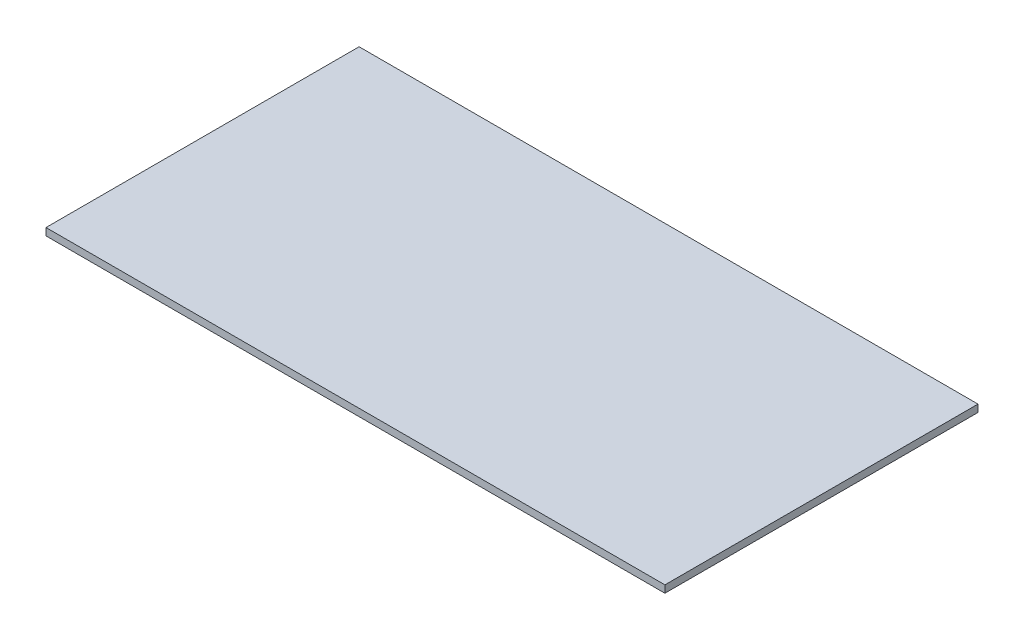
ISO-10303-21;
HEADER;
FILE_DESCRIPTION(('STEP AP214'),'2;1');
FILE_NAME('part.step','',(''),(''),'','','');
FILE_SCHEMA(('AUTOMOTIVE_DESIGN { 1 0 10303 214 1 1 1 1 }'));
ENDSEC;
DATA;
#1=APPLICATION_CONTEXT('core data for automotive mechanical design processes');
#2=APPLICATION_PROTOCOL_DEFINITION('international standard','automotive_design',2000,#1);
#3=PRODUCT_CONTEXT('',#1,'mechanical');
#4=PRODUCT('Part','Part','',(#3));
#5=PRODUCT_RELATED_PRODUCT_CATEGORY('part','',(#4));
#6=PRODUCT_DEFINITION_FORMATION('','',#4);
#7=PRODUCT_DEFINITION_CONTEXT('part definition',#1,'design');
#8=PRODUCT_DEFINITION('design','',#6,#7);
#9=PRODUCT_DEFINITION_SHAPE('','',#8);
#10=(LENGTH_UNIT() NAMED_UNIT(*) SI_UNIT(.MILLI.,.METRE.));
#11=(NAMED_UNIT(*) PLANE_ANGLE_UNIT() SI_UNIT($,.RADIAN.));
#12=(NAMED_UNIT(*) SI_UNIT($,.STERADIAN.) SOLID_ANGLE_UNIT());
#13=UNCERTAINTY_MEASURE_WITH_UNIT(LENGTH_MEASURE(1.E-05),#10,'distance_accuracy_value','');
#14=(GEOMETRIC_REPRESENTATION_CONTEXT(3) GLOBAL_UNCERTAINTY_ASSIGNED_CONTEXT((#13)) GLOBAL_UNIT_ASSIGNED_CONTEXT((#10,
#11,#12)) REPRESENTATION_CONTEXT('',''));
#15=CARTESIAN_POINT('',(0.,0.,0.));
#16=DIRECTION('',(0.,0.,1.));
#17=DIRECTION('',(1.,0.,0.));
#18=AXIS2_PLACEMENT_3D('',#15,#16,#17);
#19=CARTESIAN_POINT('',(-425.,10.,215.));
#20=DIRECTION('',(1.,0.,0.));
#21=DIRECTION('',(0.,0.,-1.));
#22=AXIS2_PLACEMENT_3D('',#19,#20,#21);
#23=PLANE('',#22);
#24=DIRECTION('',(0.,0.,1.));
#25=VECTOR('',#24,1.);
#26=CARTESIAN_POINT('',(-425.,0.,215.));
#27=LINE('',#26,#25);
#28=CARTESIAN_POINT('',(-425.,0.,-215.));
#29=VERTEX_POINT('',#28);
#30=CARTESIAN_POINT('',(-425.,0.,215.));
#31=VERTEX_POINT('',#30);
#32=EDGE_CURVE('E97',#29,#31,#27,.T.);
#33=ORIENTED_EDGE('',*,*,#32,.T.);
#34=DIRECTION('',(0.,-1.,0.));
#35=VECTOR('',#34,1.);
#36=CARTESIAN_POINT('',(-425.,10.,215.));
#37=LINE('',#36,#35);
#38=CARTESIAN_POINT('',(-425.,10.,215.));
#39=VERTEX_POINT('',#38);
#40=EDGE_CURVE('E11',#39,#31,#37,.T.);
#41=ORIENTED_EDGE('',*,*,#40,.F.);
#42=DIRECTION('',(0.,0.,1.));
#43=VECTOR('',#42,1.);
#44=CARTESIAN_POINT('',(-425.,10.,215.));
#45=LINE('',#44,#43);
#46=CARTESIAN_POINT('',(-425.,10.,-215.));
#47=VERTEX_POINT('',#46);
#48=EDGE_CURVE('E85',#47,#39,#45,.T.);
#49=ORIENTED_EDGE('',*,*,#48,.F.);
#50=DIRECTION('',(0.,-1.,0.));
#51=VECTOR('',#50,1.);
#52=CARTESIAN_POINT('',(-425.,10.,-215.));
#53=LINE('',#52,#51);
#54=EDGE_CURVE('E93',#47,#29,#53,.T.);
#55=ORIENTED_EDGE('',*,*,#54,.T.);
#56=EDGE_LOOP('',(#33,#41,#49,#55));
#57=FACE_BOUND('',#56,.T.);
#58=ADVANCED_FACE('F34',(#57),#23,.F.);
#59=CARTESIAN_POINT('',(425.,10.,215.));
#60=DIRECTION('',(0.,0.,-1.));
#61=DIRECTION('',(-1.,0.,0.));
#62=AXIS2_PLACEMENT_3D('',#59,#60,#61);
#63=PLANE('',#62);
#64=DIRECTION('',(1.,0.,0.));
#65=VECTOR('',#64,1.);
#66=CARTESIAN_POINT('',(425.,0.,215.));
#67=LINE('',#66,#65);
#68=CARTESIAN_POINT('',(425.,0.,215.));
#69=VERTEX_POINT('',#68);
#70=EDGE_CURVE('E89',#31,#69,#67,.T.);
#71=ORIENTED_EDGE('',*,*,#70,.T.);
#72=DIRECTION('',(0.,-1.,0.));
#73=VECTOR('',#72,1.);
#74=CARTESIAN_POINT('',(425.,10.,215.));
#75=LINE('',#74,#73);
#76=CARTESIAN_POINT('',(425.,10.,215.));
#77=VERTEX_POINT('',#76);
#78=EDGE_CURVE('E42',#77,#69,#75,.T.);
#79=ORIENTED_EDGE('',*,*,#78,.F.);
#80=DIRECTION('',(1.,0.,0.));
#81=VECTOR('',#80,1.);
#82=CARTESIAN_POINT('',(425.,10.,215.));
#83=LINE('',#82,#81);
#84=EDGE_CURVE('E80',#39,#77,#83,.T.);
#85=ORIENTED_EDGE('',*,*,#84,.F.);
#86=ORIENTED_EDGE('',*,*,#40,.T.);
#87=EDGE_LOOP('',(#71,#79,#85,#86));
#88=FACE_BOUND('',#87,.T.);
#89=ADVANCED_FACE('F88',(#88),#63,.F.);
#90=CARTESIAN_POINT('',(425.,10.,215.));
#91=DIRECTION('',(-1.,0.,0.));
#92=DIRECTION('',(0.,0.,1.));
#93=AXIS2_PLACEMENT_3D('',#90,#91,#92);
#94=PLANE('',#93);
#95=DIRECTION('',(0.,0.,-1.));
#96=VECTOR('',#95,1.);
#97=CARTESIAN_POINT('',(425.,0.,215.));
#98=LINE('',#97,#96);
#99=CARTESIAN_POINT('',(425.,0.,-215.));
#100=VERTEX_POINT('',#99);
#101=EDGE_CURVE('E67',#69,#100,#98,.T.);
#102=ORIENTED_EDGE('',*,*,#101,.T.);
#103=DIRECTION('',(0.,-1.,0.));
#104=VECTOR('',#103,1.);
#105=CARTESIAN_POINT('',(425.,10.,-215.));
#106=LINE('',#105,#104);
#107=CARTESIAN_POINT('',(425.,10.,-215.));
#108=VERTEX_POINT('',#107);
#109=EDGE_CURVE('E90',#108,#100,#106,.T.);
#110=ORIENTED_EDGE('',*,*,#109,.F.);
#111=DIRECTION('',(0.,0.,-1.));
#112=VECTOR('',#111,1.);
#113=CARTESIAN_POINT('',(425.,10.,215.));
#114=LINE('',#113,#112);
#115=EDGE_CURVE('E83',#77,#108,#114,.T.);
#116=ORIENTED_EDGE('',*,*,#115,.F.);
#117=ORIENTED_EDGE('',*,*,#78,.T.);
#118=EDGE_LOOP('',(#102,#110,#116,#117));
#119=FACE_BOUND('',#118,.T.);
#120=ADVANCED_FACE('F91',(#119),#94,.F.);
#121=CARTESIAN_POINT('',(425.,10.,-215.));
#122=DIRECTION('',(0.,0.,1.));
#123=DIRECTION('',(1.,0.,0.));
#124=AXIS2_PLACEMENT_3D('',#121,#122,#123);
#125=PLANE('',#124);
#126=DIRECTION('',(-1.,0.,0.));
#127=VECTOR('',#126,1.);
#128=CARTESIAN_POINT('',(425.,0.,-215.));
#129=LINE('',#128,#127);
#130=EDGE_CURVE('E73',#100,#29,#129,.T.);
#131=ORIENTED_EDGE('',*,*,#130,.T.);
#132=ORIENTED_EDGE('',*,*,#54,.F.);
#133=DIRECTION('',(-1.,0.,0.));
#134=VECTOR('',#133,1.);
#135=CARTESIAN_POINT('',(425.,10.,-215.));
#136=LINE('',#135,#134);
#137=EDGE_CURVE('E50',#108,#47,#136,.T.);
#138=ORIENTED_EDGE('',*,*,#137,.F.);
#139=ORIENTED_EDGE('',*,*,#109,.T.);
#140=EDGE_LOOP('',(#131,#132,#138,#139));
#141=FACE_BOUND('',#140,.T.);
#142=ADVANCED_FACE('F104',(#141),#125,.F.);
#143=CARTESIAN_POINT('',(0.,10.,0.));
#144=DIRECTION('',(0.,1.,0.));
#145=DIRECTION('',(0.,0.,1.));
#146=AXIS2_PLACEMENT_3D('',#143,#144,#145);
#147=PLANE('',#146);
#148=ORIENTED_EDGE('',*,*,#48,.T.);
#149=ORIENTED_EDGE('',*,*,#84,.T.);
#150=ORIENTED_EDGE('',*,*,#115,.T.);
#151=ORIENTED_EDGE('',*,*,#137,.T.);
#152=EDGE_LOOP('',(#148,#149,#150,#151));
#153=FACE_BOUND('',#152,.T.);
#154=ADVANCED_FACE('F81',(#153),#147,.T.);
#155=CARTESIAN_POINT('',(0.,0.,0.));
#156=DIRECTION('',(0.,1.,0.));
#157=DIRECTION('',(0.,0.,1.));
#158=AXIS2_PLACEMENT_3D('',#155,#156,#157);
#159=PLANE('',#158);
#160=ORIENTED_EDGE('',*,*,#32,.F.);
#161=ORIENTED_EDGE('',*,*,#130,.F.);
#162=ORIENTED_EDGE('',*,*,#101,.F.);
#163=ORIENTED_EDGE('',*,*,#70,.F.);
#164=EDGE_LOOP('',(#160,#161,#162,#163));
#165=FACE_BOUND('',#164,.T.);
#166=ADVANCED_FACE('F107',(#165),#159,.F.);
#167=CLOSED_SHELL('',(#58,#89,#120,#142,#154,#166));
#168=MANIFOLD_SOLID_BREP('B2',#167);
#169=ADVANCED_BREP_SHAPE_REPRESENTATION('',(#18,#168),#14);
#170=SHAPE_DEFINITION_REPRESENTATION(#9,#169);
ENDSEC;
END-ISO-10303-21;
